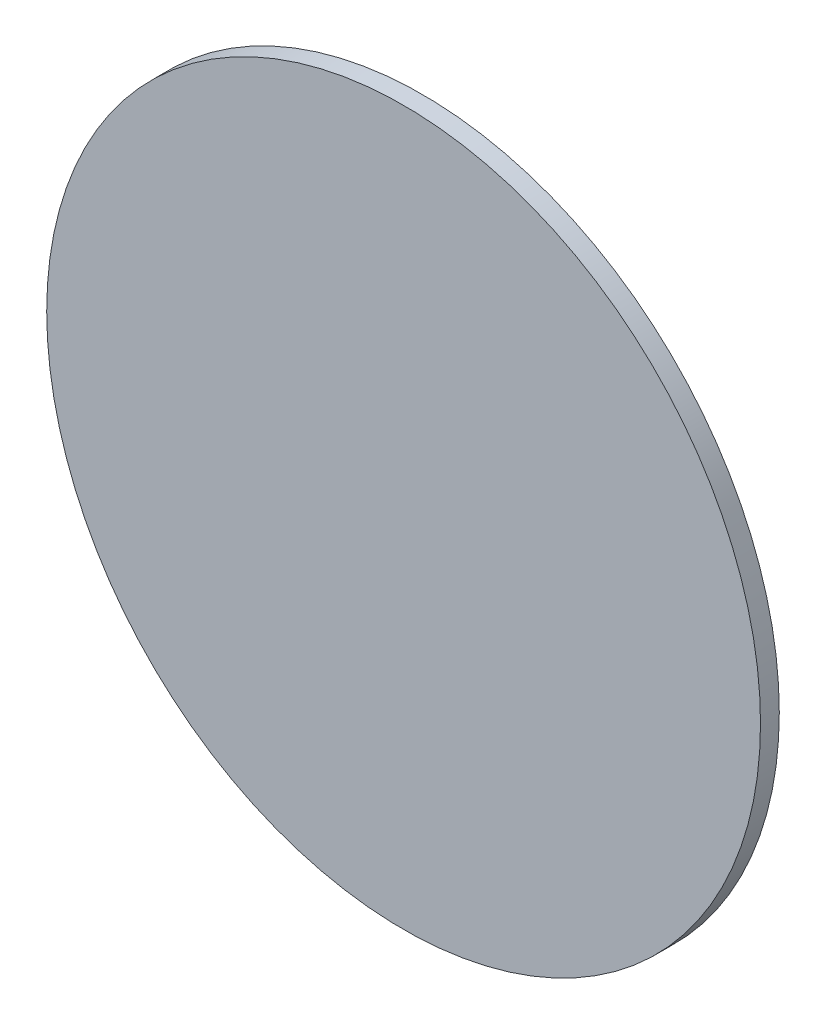
ISO-10303-21;
HEADER;
FILE_DESCRIPTION(('STEP AP214'),'2;1');
FILE_NAME('part.step','',(''),(''),'','','');
FILE_SCHEMA(('AUTOMOTIVE_DESIGN { 1 0 10303 214 1 1 1 1 }'));
ENDSEC;
DATA;
#1=APPLICATION_CONTEXT('core data for automotive mechanical design processes');
#2=APPLICATION_PROTOCOL_DEFINITION('international standard','automotive_design',2000,#1);
#3=PRODUCT_CONTEXT('',#1,'mechanical');
#4=PRODUCT('Part','Part','',(#3));
#5=PRODUCT_RELATED_PRODUCT_CATEGORY('part','',(#4));
#6=PRODUCT_DEFINITION_FORMATION('','',#4);
#7=PRODUCT_DEFINITION_CONTEXT('part definition',#1,'design');
#8=PRODUCT_DEFINITION('design','',#6,#7);
#9=PRODUCT_DEFINITION_SHAPE('','',#8);
#10=(LENGTH_UNIT() NAMED_UNIT(*) SI_UNIT(.MILLI.,.METRE.));
#11=(NAMED_UNIT(*) PLANE_ANGLE_UNIT() SI_UNIT($,.RADIAN.));
#12=(NAMED_UNIT(*) SI_UNIT($,.STERADIAN.) SOLID_ANGLE_UNIT());
#13=UNCERTAINTY_MEASURE_WITH_UNIT(LENGTH_MEASURE(1.E-05),#10,'distance_accuracy_value','');
#14=(GEOMETRIC_REPRESENTATION_CONTEXT(3) GLOBAL_UNCERTAINTY_ASSIGNED_CONTEXT((#13)) GLOBAL_UNIT_ASSIGNED_CONTEXT((#10,
#11,#12)) REPRESENTATION_CONTEXT('',''));
#15=CARTESIAN_POINT('',(0.,0.,0.));
#16=DIRECTION('',(0.,0.,1.));
#17=DIRECTION('',(1.,0.,0.));
#18=AXIS2_PLACEMENT_3D('',#15,#16,#17);
#19=CARTESIAN_POINT('',(0.,0.,1.));
#20=DIRECTION('',(0.,0.,-1.));
#21=DIRECTION('',(-1.,0.,0.));
#22=AXIS2_PLACEMENT_3D('',#19,#20,#21);
#23=CYLINDRICAL_SURFACE('',#22,19.);
#24=CARTESIAN_POINT('',(0.,0.,1.));
#25=DIRECTION('',(0.,0.,1.));
#26=DIRECTION('',(1.,0.,0.));
#27=AXIS2_PLACEMENT_3D('',#24,#25,#26);
#28=CIRCLE('',#27,19.);
#29=CARTESIAN_POINT('',(19.,0.,1.));
#30=VERTEX_POINT('',#29);
#31=EDGE_CURVE('E12',#30,#30,#28,.T.);
#32=ORIENTED_EDGE('',*,*,#31,.F.);
#33=EDGE_LOOP('',(#32));
#34=FACE_BOUND('',#33,.T.);
#35=CARTESIAN_POINT('',(0.,0.,0.));
#36=DIRECTION('',(0.,0.,1.));
#37=DIRECTION('',(1.,0.,0.));
#38=AXIS2_PLACEMENT_3D('',#35,#36,#37);
#39=CIRCLE('',#38,19.);
#40=CARTESIAN_POINT('',(19.,0.,0.));
#41=VERTEX_POINT('',#40);
#42=EDGE_CURVE('E48',#41,#41,#39,.T.);
#43=ORIENTED_EDGE('',*,*,#42,.T.);
#44=EDGE_LOOP('',(#43));
#45=FACE_BOUND('',#44,.T.);
#46=ADVANCED_FACE('F45',(#34,#45),#23,.T.);
#47=CARTESIAN_POINT('',(0.,0.,1.));
#48=DIRECTION('',(0.,0.,1.));
#49=DIRECTION('',(1.,0.,0.));
#50=AXIS2_PLACEMENT_3D('',#47,#48,#49);
#51=PLANE('',#50);
#52=ORIENTED_EDGE('',*,*,#31,.T.);
#53=EDGE_LOOP('',(#52));
#54=FACE_BOUND('',#53,.T.);
#55=ADVANCED_FACE('F60',(#54),#51,.T.);
#56=CARTESIAN_POINT('',(0.,0.,0.));
#57=DIRECTION('',(0.,0.,1.));
#58=DIRECTION('',(1.,0.,0.));
#59=AXIS2_PLACEMENT_3D('',#56,#57,#58);
#60=PLANE('',#59);
#61=ORIENTED_EDGE('',*,*,#42,.F.);
#62=EDGE_LOOP('',(#61));
#63=FACE_BOUND('',#62,.T.);
#64=ADVANCED_FACE('F58',(#63),#60,.F.);
#65=CLOSED_SHELL('',(#46,#55,#64));
#66=MANIFOLD_SOLID_BREP('B2',#65);
#67=ADVANCED_BREP_SHAPE_REPRESENTATION('',(#18,#66),#14);
#68=SHAPE_DEFINITION_REPRESENTATION(#9,#67);
ENDSEC;
END-ISO-10303-21;
